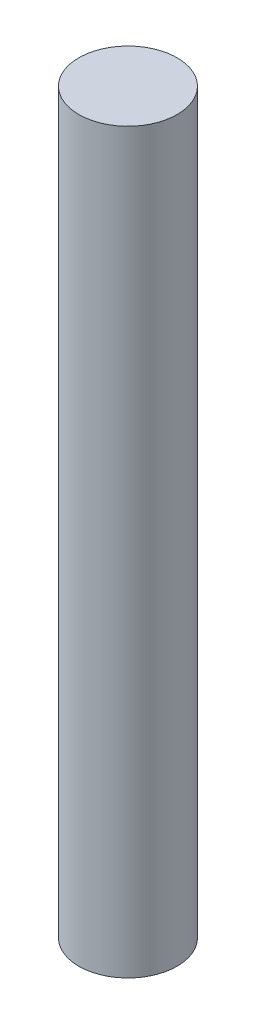
ISO-10303-21;
HEADER;
FILE_DESCRIPTION(('STEP AP214'),'2;1');
FILE_NAME('part.step','',(''),(''),'','','');
FILE_SCHEMA(('AUTOMOTIVE_DESIGN { 1 0 10303 214 1 1 1 1 }'));
ENDSEC;
DATA;
#1=APPLICATION_CONTEXT('core data for automotive mechanical design processes');
#2=APPLICATION_PROTOCOL_DEFINITION('international standard','automotive_design',2000,#1);
#3=PRODUCT_CONTEXT('',#1,'mechanical');
#4=PRODUCT('Part','Part','',(#3));
#5=PRODUCT_RELATED_PRODUCT_CATEGORY('part','',(#4));
#6=PRODUCT_DEFINITION_FORMATION('','',#4);
#7=PRODUCT_DEFINITION_CONTEXT('part definition',#1,'design');
#8=PRODUCT_DEFINITION('design','',#6,#7);
#9=PRODUCT_DEFINITION_SHAPE('','',#8);
#10=(LENGTH_UNIT() NAMED_UNIT(*) SI_UNIT(.MILLI.,.METRE.));
#11=(NAMED_UNIT(*) PLANE_ANGLE_UNIT() SI_UNIT($,.RADIAN.));
#12=(NAMED_UNIT(*) SI_UNIT($,.STERADIAN.) SOLID_ANGLE_UNIT());
#13=UNCERTAINTY_MEASURE_WITH_UNIT(LENGTH_MEASURE(1.E-05),#10,'distance_accuracy_value','');
#14=(GEOMETRIC_REPRESENTATION_CONTEXT(3) GLOBAL_UNCERTAINTY_ASSIGNED_CONTEXT((#13)) GLOBAL_UNIT_ASSIGNED_CONTEXT((#10,
#11,#12)) REPRESENTATION_CONTEXT('',''));
#15=CARTESIAN_POINT('',(0.,0.,0.));
#16=DIRECTION('',(0.,0.,1.));
#17=DIRECTION('',(1.,0.,0.));
#18=AXIS2_PLACEMENT_3D('',#15,#16,#17);
#19=CARTESIAN_POINT('',(0.,60.,0.));
#20=DIRECTION('',(0.,-1.,0.));
#21=DIRECTION('',(0.,0.,-1.));
#22=AXIS2_PLACEMENT_3D('',#19,#20,#21);
#23=CYLINDRICAL_SURFACE('',#22,8.);
#24=CARTESIAN_POINT('',(0.,60.,0.));
#25=DIRECTION('',(0.,1.,0.));
#26=DIRECTION('',(0.,0.,1.));
#27=AXIS2_PLACEMENT_3D('',#24,#25,#26);
#28=CIRCLE('',#27,8.);
#29=CARTESIAN_POINT('',(0.,60.,8.));
#30=VERTEX_POINT('',#29);
#31=EDGE_CURVE('E10',#30,#30,#28,.T.);
#32=ORIENTED_EDGE('',*,*,#31,.F.);
#33=EDGE_LOOP('',(#32));
#34=FACE_BOUND('',#33,.T.);
#35=CARTESIAN_POINT('',(0.,-60.,0.));
#36=DIRECTION('',(0.,1.,0.));
#37=DIRECTION('',(0.,0.,1.));
#38=AXIS2_PLACEMENT_3D('',#35,#36,#37);
#39=CIRCLE('',#38,8.);
#40=CARTESIAN_POINT('',(0.,-60.,8.));
#41=VERTEX_POINT('',#40);
#42=EDGE_CURVE('E39',#41,#41,#39,.T.);
#43=ORIENTED_EDGE('',*,*,#42,.T.);
#44=EDGE_LOOP('',(#43));
#45=FACE_BOUND('',#44,.T.);
#46=ADVANCED_FACE('F36',(#34,#45),#23,.T.);
#47=CARTESIAN_POINT('',(0.,60.,0.));
#48=DIRECTION('',(0.,1.,0.));
#49=DIRECTION('',(0.,0.,1.));
#50=AXIS2_PLACEMENT_3D('',#47,#48,#49);
#51=PLANE('',#50);
#52=ORIENTED_EDGE('',*,*,#31,.T.);
#53=EDGE_LOOP('',(#52));
#54=FACE_BOUND('',#53,.T.);
#55=ADVANCED_FACE('F51',(#54),#51,.T.);
#56=CARTESIAN_POINT('',(0.,-60.,0.));
#57=DIRECTION('',(0.,1.,0.));
#58=DIRECTION('',(0.,0.,1.));
#59=AXIS2_PLACEMENT_3D('',#56,#57,#58);
#60=PLANE('',#59);
#61=ORIENTED_EDGE('',*,*,#42,.F.);
#62=EDGE_LOOP('',(#61));
#63=FACE_BOUND('',#62,.T.);
#64=ADVANCED_FACE('F49',(#63),#60,.F.);
#65=CLOSED_SHELL('',(#46,#55,#64));
#66=MANIFOLD_SOLID_BREP('B2',#65);
#67=ADVANCED_BREP_SHAPE_REPRESENTATION('',(#18,#66),#14);
#68=SHAPE_DEFINITION_REPRESENTATION(#9,#67);
ENDSEC;
END-ISO-10303-21;
